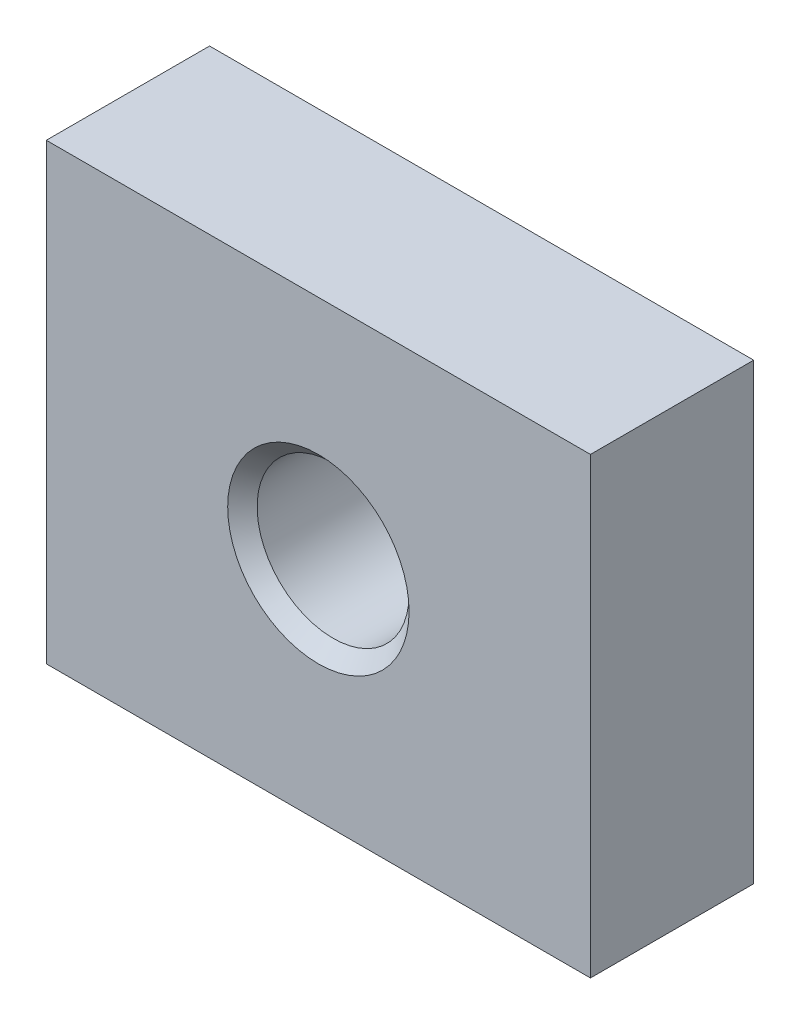
ISO-10303-21;
HEADER;
FILE_DESCRIPTION(('STEP AP214'),'2;1');
FILE_NAME('part.step','',(''),(''),'','','');
FILE_SCHEMA(('AUTOMOTIVE_DESIGN { 1 0 10303 214 1 1 1 1 }'));
ENDSEC;
DATA;
#1=APPLICATION_CONTEXT('core data for automotive mechanical design processes');
#2=APPLICATION_PROTOCOL_DEFINITION('international standard','automotive_design',2000,#1);
#3=PRODUCT_CONTEXT('',#1,'mechanical');
#4=PRODUCT('Part','Part','',(#3));
#5=PRODUCT_RELATED_PRODUCT_CATEGORY('part','',(#4));
#6=PRODUCT_DEFINITION_FORMATION('','',#4);
#7=PRODUCT_DEFINITION_CONTEXT('part definition',#1,'design');
#8=PRODUCT_DEFINITION('design','',#6,#7);
#9=PRODUCT_DEFINITION_SHAPE('','',#8);
#10=(LENGTH_UNIT() NAMED_UNIT(*) SI_UNIT(.MILLI.,.METRE.));
#11=(NAMED_UNIT(*) PLANE_ANGLE_UNIT() SI_UNIT($,.RADIAN.));
#12=(NAMED_UNIT(*) SI_UNIT($,.STERADIAN.) SOLID_ANGLE_UNIT());
#13=UNCERTAINTY_MEASURE_WITH_UNIT(LENGTH_MEASURE(1.E-05),#10,'distance_accuracy_value','');
#14=(GEOMETRIC_REPRESENTATION_CONTEXT(3) GLOBAL_UNCERTAINTY_ASSIGNED_CONTEXT((#13)) GLOBAL_UNIT_ASSIGNED_CONTEXT((#10,
#11,#12)) REPRESENTATION_CONTEXT('',''));
#15=CARTESIAN_POINT('',(0.,0.,0.));
#16=DIRECTION('',(0.,0.,1.));
#17=DIRECTION('',(1.,0.,0.));
#18=AXIS2_PLACEMENT_3D('',#15,#16,#17);
#19=CARTESIAN_POINT('',(0.,0.,4.50000000000728));
#20=DIRECTION('',(0.,0.,1.));
#21=DIRECTION('',(1.,0.,0.));
#22=AXIS2_PLACEMENT_3D('',#19,#20,#21);
#23=CONICAL_SURFACE('',#22,4.99999999999545,0.785398163397448);
#24=CARTESIAN_POINT('',(0.,0.,3.688));
#25=DIRECTION('',(0.,0.,1.));
#26=DIRECTION('',(1.,0.,0.));
#27=AXIS2_PLACEMENT_3D('',#24,#25,#26);
#28=CIRCLE('',#27,4.188);
#29=CARTESIAN_POINT('',(4.188,0.,3.688));
#30=VERTEX_POINT('',#29);
#31=EDGE_CURVE('E68',#30,#30,#28,.F.);
#32=ORIENTED_EDGE('',*,*,#31,.T.);
#33=EDGE_LOOP('',(#32));
#34=FACE_BOUND('',#33,.T.);
#35=CARTESIAN_POINT('',(0.,0.,4.50000000000728));
#36=DIRECTION('',(0.,0.,1.));
#37=DIRECTION('',(1.,0.,0.));
#38=AXIS2_PLACEMENT_3D('',#35,#36,#37);
#39=CIRCLE('',#38,4.99999999999545);
#40=CARTESIAN_POINT('',(4.99999999999545,0.,4.50000000000728));
#41=VERTEX_POINT('',#40);
#42=EDGE_CURVE('E20',#41,#41,#39,.F.);
#43=ORIENTED_EDGE('',*,*,#42,.F.);
#44=EDGE_LOOP('',(#43));
#45=FACE_BOUND('',#44,.T.);
#46=ADVANCED_FACE('F17',(#34,#45),#23,.F.);
#47=CARTESIAN_POINT('',(0.,0.,4.5));
#48=DIRECTION('',(0.,0.,1.));
#49=DIRECTION('',(1.,0.,0.));
#50=AXIS2_PLACEMENT_3D('',#47,#48,#49);
#51=PLANE('',#50);
#52=ORIENTED_EDGE('',*,*,#42,.T.);
#53=EDGE_LOOP('',(#52));
#54=FACE_BOUND('',#53,.T.);
#55=DIRECTION('',(0.,1.,0.));
#56=VECTOR('',#55,1.);
#57=CARTESIAN_POINT('',(15.,-12.5,4.5));
#58=LINE('',#57,#56);
#59=CARTESIAN_POINT('',(15.,-12.5,4.5));
#60=VERTEX_POINT('',#59);
#61=CARTESIAN_POINT('',(15.,12.5,4.5));
#62=VERTEX_POINT('',#61);
#63=EDGE_CURVE('E56',#60,#62,#58,.T.);
#64=ORIENTED_EDGE('',*,*,#63,.T.);
#65=DIRECTION('',(1.,0.,0.));
#66=VECTOR('',#65,1.);
#67=CARTESIAN_POINT('',(15.,12.5,4.5));
#68=LINE('',#67,#66);
#69=CARTESIAN_POINT('',(-15.,12.5,4.5));
#70=VERTEX_POINT('',#69);
#71=EDGE_CURVE('E208',#62,#70,#68,.F.);
#72=ORIENTED_EDGE('',*,*,#71,.T.);
#73=DIRECTION('',(0.,1.,0.));
#74=VECTOR('',#73,1.);
#75=CARTESIAN_POINT('',(-15.,12.5,4.5));
#76=LINE('',#75,#74);
#77=CARTESIAN_POINT('',(-15.,-12.5,4.5));
#78=VERTEX_POINT('',#77);
#79=EDGE_CURVE('E61',#70,#78,#76,.F.);
#80=ORIENTED_EDGE('',*,*,#79,.T.);
#81=DIRECTION('',(1.,0.,0.));
#82=VECTOR('',#81,1.);
#83=CARTESIAN_POINT('',(-15.,-12.5,4.5));
#84=LINE('',#83,#82);
#85=EDGE_CURVE('E59',#78,#60,#84,.T.);
#86=ORIENTED_EDGE('',*,*,#85,.T.);
#87=EDGE_LOOP('',(#64,#72,#80,#86));
#88=FACE_BOUND('',#87,.T.);
#89=ADVANCED_FACE('F60',(#54,#88),#51,.T.);
#90=CARTESIAN_POINT('',(0.,0.,-4.5));
#91=DIRECTION('',(0.,0.,1.));
#92=DIRECTION('',(1.,0.,0.));
#93=AXIS2_PLACEMENT_3D('',#90,#91,#92);
#94=CYLINDRICAL_SURFACE('',#93,4.188);
#95=CARTESIAN_POINT('',(0.,0.,-3.68800000001102));
#96=DIRECTION('',(0.,0.,-1.));
#97=DIRECTION('',(-1.,0.,0.));
#98=AXIS2_PLACEMENT_3D('',#95,#96,#97);
#99=CIRCLE('',#98,4.18799999999919);
#100=CARTESIAN_POINT('',(-4.18799999999919,0.,-3.68800000001102));
#101=VERTEX_POINT('',#100);
#102=EDGE_CURVE('E88',#101,#101,#99,.T.);
#103=ORIENTED_EDGE('',*,*,#102,.T.);
#104=EDGE_LOOP('',(#103));
#105=FACE_BOUND('',#104,.T.);
#106=ORIENTED_EDGE('',*,*,#31,.F.);
#107=EDGE_LOOP('',(#106));
#108=FACE_BOUND('',#107,.T.);
#109=ADVANCED_FACE('F107',(#105,#108),#94,.F.);
#110=CARTESIAN_POINT('',(-15.,-12.5,4.5));
#111=DIRECTION('',(0.,1.,0.));
#112=DIRECTION('',(0.,0.,1.));
#113=AXIS2_PLACEMENT_3D('',#110,#111,#112);
#114=PLANE('',#113);
#115=DIRECTION('',(0.,0.,1.));
#116=VECTOR('',#115,1.);
#117=CARTESIAN_POINT('',(15.,-12.5,4.5));
#118=LINE('',#117,#116);
#119=CARTESIAN_POINT('',(15.,-12.5,-4.5));
#120=VERTEX_POINT('',#119);
#121=EDGE_CURVE('E67',#120,#60,#118,.T.);
#122=ORIENTED_EDGE('',*,*,#121,.T.);
#123=ORIENTED_EDGE('',*,*,#85,.F.);
#124=DIRECTION('',(0.,0.,-1.));
#125=VECTOR('',#124,1.);
#126=CARTESIAN_POINT('',(-15.,-12.5,4.5));
#127=LINE('',#126,#125);
#128=CARTESIAN_POINT('',(-15.,-12.5,-4.5));
#129=VERTEX_POINT('',#128);
#130=EDGE_CURVE('E92',#78,#129,#127,.T.);
#131=ORIENTED_EDGE('',*,*,#130,.T.);
#132=DIRECTION('',(1.,0.,0.));
#133=VECTOR('',#132,1.);
#134=CARTESIAN_POINT('',(0.,-12.5,-4.5));
#135=LINE('',#134,#133);
#136=EDGE_CURVE('E80',#129,#120,#135,.T.);
#137=ORIENTED_EDGE('',*,*,#136,.T.);
#138=EDGE_LOOP('',(#122,#123,#131,#137));
#139=FACE_BOUND('',#138,.T.);
#140=ADVANCED_FACE('F79',(#139),#114,.F.);
#141=CARTESIAN_POINT('',(15.,-12.5,4.5));
#142=DIRECTION('',(-1.,0.,0.));
#143=DIRECTION('',(0.,0.,1.));
#144=AXIS2_PLACEMENT_3D('',#141,#142,#143);
#145=PLANE('',#144);
#146=DIRECTION('',(0.,0.,-1.));
#147=VECTOR('',#146,1.);
#148=CARTESIAN_POINT('',(15.,12.5,4.5));
#149=LINE('',#148,#147);
#150=CARTESIAN_POINT('',(15.,12.5,-4.5));
#151=VERTEX_POINT('',#150);
#152=EDGE_CURVE('E75',#151,#62,#149,.F.);
#153=ORIENTED_EDGE('',*,*,#152,.T.);
#154=ORIENTED_EDGE('',*,*,#63,.F.);
#155=ORIENTED_EDGE('',*,*,#121,.F.);
#156=DIRECTION('',(0.,1.,0.));
#157=VECTOR('',#156,1.);
#158=CARTESIAN_POINT('',(15.,0.,-4.5));
#159=LINE('',#158,#157);
#160=EDGE_CURVE('E221',#120,#151,#159,.T.);
#161=ORIENTED_EDGE('',*,*,#160,.T.);
#162=EDGE_LOOP('',(#153,#154,#155,#161));
#163=FACE_BOUND('',#162,.T.);
#164=ADVANCED_FACE('F72',(#163),#145,.F.);
#165=CARTESIAN_POINT('',(15.,12.5,4.5));
#166=DIRECTION('',(0.,-1.,0.));
#167=DIRECTION('',(0.,0.,-1.));
#168=AXIS2_PLACEMENT_3D('',#165,#166,#167);
#169=PLANE('',#168);
#170=DIRECTION('',(0.,0.,-1.));
#171=VECTOR('',#170,1.);
#172=CARTESIAN_POINT('',(-15.,12.5,4.5));
#173=LINE('',#172,#171);
#174=CARTESIAN_POINT('',(-15.,12.5,-4.5));
#175=VERTEX_POINT('',#174);
#176=EDGE_CURVE('E35',#175,#70,#173,.F.);
#177=ORIENTED_EDGE('',*,*,#176,.T.);
#178=ORIENTED_EDGE('',*,*,#71,.F.);
#179=ORIENTED_EDGE('',*,*,#152,.F.);
#180=DIRECTION('',(1.,0.,0.));
#181=VECTOR('',#180,1.);
#182=CARTESIAN_POINT('',(0.,12.5,-4.5));
#183=LINE('',#182,#181);
#184=EDGE_CURVE('E210',#151,#175,#183,.F.);
#185=ORIENTED_EDGE('',*,*,#184,.T.);
#186=EDGE_LOOP('',(#177,#178,#179,#185));
#187=FACE_BOUND('',#186,.T.);
#188=ADVANCED_FACE('F123',(#187),#169,.F.);
#189=CARTESIAN_POINT('',(-15.,12.5,4.5));
#190=DIRECTION('',(1.,0.,0.));
#191=DIRECTION('',(0.,0.,-1.));
#192=AXIS2_PLACEMENT_3D('',#189,#190,#191);
#193=PLANE('',#192);
#194=ORIENTED_EDGE('',*,*,#130,.F.);
#195=ORIENTED_EDGE('',*,*,#79,.F.);
#196=ORIENTED_EDGE('',*,*,#176,.F.);
#197=DIRECTION('',(0.,1.,0.));
#198=VECTOR('',#197,1.);
#199=CARTESIAN_POINT('',(-15.,0.,-4.5));
#200=LINE('',#199,#198);
#201=EDGE_CURVE('E27',#175,#129,#200,.F.);
#202=ORIENTED_EDGE('',*,*,#201,.T.);
#203=EDGE_LOOP('',(#194,#195,#196,#202));
#204=FACE_BOUND('',#203,.T.);
#205=ADVANCED_FACE('F115',(#204),#193,.F.);
#206=CARTESIAN_POINT('',(0.,0.,-4.50000000000728));
#207=DIRECTION('',(0.,0.,-1.));
#208=DIRECTION('',(-1.,0.,0.));
#209=AXIS2_PLACEMENT_3D('',#206,#207,#208);
#210=CONICAL_SURFACE('',#209,4.99999999999545,0.785398163397448);
#211=ORIENTED_EDGE('',*,*,#102,.F.);
#212=EDGE_LOOP('',(#211));
#213=FACE_BOUND('',#212,.T.);
#214=CARTESIAN_POINT('',(0.,0.,-4.50000000000728));
#215=DIRECTION('',(0.,0.,-1.));
#216=DIRECTION('',(-1.,0.,0.));
#217=AXIS2_PLACEMENT_3D('',#214,#215,#216);
#218=CIRCLE('',#217,4.99999999999545);
#219=CARTESIAN_POINT('',(-4.99999999999545,0.,-4.50000000000728));
#220=VERTEX_POINT('',#219);
#221=EDGE_CURVE('E11',#220,#220,#218,.T.);
#222=ORIENTED_EDGE('',*,*,#221,.T.);
#223=EDGE_LOOP('',(#222));
#224=FACE_BOUND('',#223,.T.);
#225=ADVANCED_FACE('F110',(#213,#224),#210,.F.);
#226=CARTESIAN_POINT('',(0.,0.,-4.5));
#227=DIRECTION('',(0.,0.,1.));
#228=DIRECTION('',(1.,0.,0.));
#229=AXIS2_PLACEMENT_3D('',#226,#227,#228);
#230=PLANE('',#229);
#231=ORIENTED_EDGE('',*,*,#221,.F.);
#232=EDGE_LOOP('',(#231));
#233=FACE_BOUND('',#232,.T.);
#234=ORIENTED_EDGE('',*,*,#184,.F.);
#235=ORIENTED_EDGE('',*,*,#160,.F.);
#236=ORIENTED_EDGE('',*,*,#136,.F.);
#237=ORIENTED_EDGE('',*,*,#201,.F.);
#238=EDGE_LOOP('',(#234,#235,#236,#237));
#239=FACE_BOUND('',#238,.T.);
#240=ADVANCED_FACE('F108',(#233,#239),#230,.F.);
#241=CLOSED_SHELL('',(#46,#89,#109,#140,#164,#188,#205,#225,#240));
#242=MANIFOLD_SOLID_BREP('B1',#241);
#243=ADVANCED_BREP_SHAPE_REPRESENTATION('',(#18,#242),#14);
#244=SHAPE_DEFINITION_REPRESENTATION(#9,#243);
ENDSEC;
END-ISO-10303-21;
